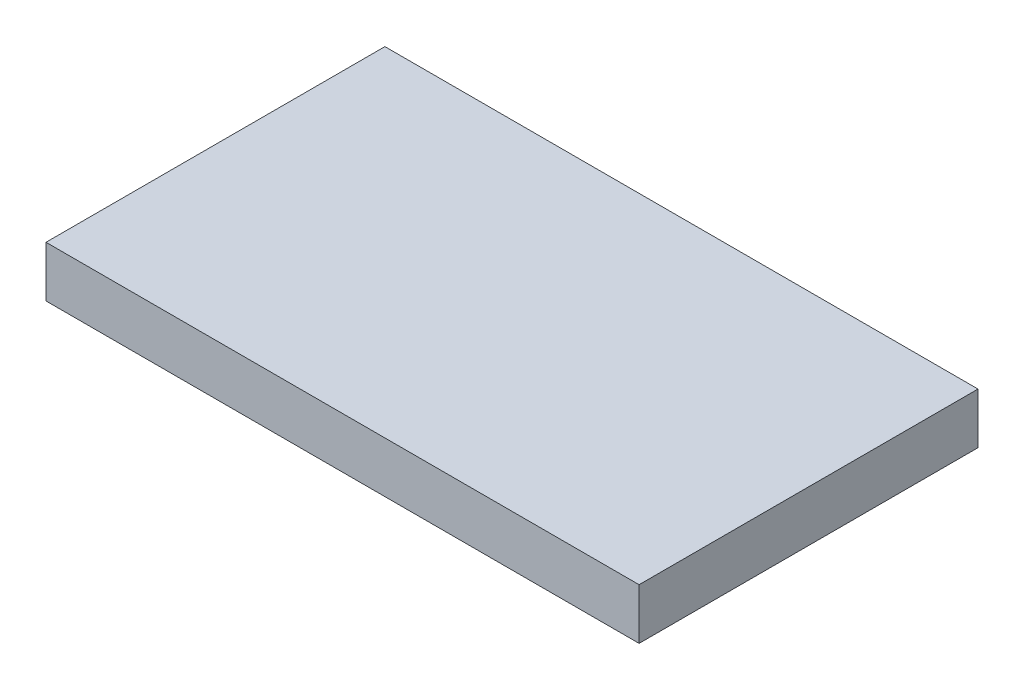
ISO-10303-21;
HEADER;
FILE_DESCRIPTION(('STEP AP214'),'2;1');
FILE_NAME('part.step','',(''),(''),'','','');
FILE_SCHEMA(('AUTOMOTIVE_DESIGN { 1 0 10303 214 1 1 1 1 }'));
ENDSEC;
DATA;
#1=APPLICATION_CONTEXT('core data for automotive mechanical design processes');
#2=APPLICATION_PROTOCOL_DEFINITION('international standard','automotive_design',2000,#1);
#3=PRODUCT_CONTEXT('',#1,'mechanical');
#4=PRODUCT('Part','Part','',(#3));
#5=PRODUCT_RELATED_PRODUCT_CATEGORY('part','',(#4));
#6=PRODUCT_DEFINITION_FORMATION('','',#4);
#7=PRODUCT_DEFINITION_CONTEXT('part definition',#1,'design');
#8=PRODUCT_DEFINITION('design','',#6,#7);
#9=PRODUCT_DEFINITION_SHAPE('','',#8);
#10=(LENGTH_UNIT() NAMED_UNIT(*) SI_UNIT(.MILLI.,.METRE.));
#11=(NAMED_UNIT(*) PLANE_ANGLE_UNIT() SI_UNIT($,.RADIAN.));
#12=(NAMED_UNIT(*) SI_UNIT($,.STERADIAN.) SOLID_ANGLE_UNIT());
#13=UNCERTAINTY_MEASURE_WITH_UNIT(LENGTH_MEASURE(1.E-05),#10,'distance_accuracy_value','');
#14=(GEOMETRIC_REPRESENTATION_CONTEXT(3) GLOBAL_UNCERTAINTY_ASSIGNED_CONTEXT((#13)) GLOBAL_UNIT_ASSIGNED_CONTEXT((#10,
#11,#12)) REPRESENTATION_CONTEXT('',''));
#15=CARTESIAN_POINT('',(0.,0.,0.));
#16=DIRECTION('',(0.,0.,1.));
#17=DIRECTION('',(1.,0.,0.));
#18=AXIS2_PLACEMENT_3D('',#15,#16,#17);
#19=CARTESIAN_POINT('',(-8.75,1.5,-5.));
#20=DIRECTION('',(1.,0.,0.));
#21=DIRECTION('',(0.,0.,-1.));
#22=AXIS2_PLACEMENT_3D('',#19,#20,#21);
#23=PLANE('',#22);
#24=DIRECTION('',(0.,0.,1.));
#25=VECTOR('',#24,1.);
#26=CARTESIAN_POINT('',(-8.75,0.,-5.));
#27=LINE('',#26,#25);
#28=CARTESIAN_POINT('',(-8.75,0.,-5.));
#29=VERTEX_POINT('',#28);
#30=CARTESIAN_POINT('',(-8.75,0.,5.));
#31=VERTEX_POINT('',#30);
#32=EDGE_CURVE('E111',#29,#31,#27,.T.);
#33=ORIENTED_EDGE('',*,*,#32,.T.);
#34=DIRECTION('',(0.,-1.,0.));
#35=VECTOR('',#34,1.);
#36=CARTESIAN_POINT('',(-8.75,1.5,5.));
#37=LINE('',#36,#35);
#38=CARTESIAN_POINT('',(-8.75,1.5,5.));
#39=VERTEX_POINT('',#38);
#40=EDGE_CURVE('E11',#39,#31,#37,.T.);
#41=ORIENTED_EDGE('',*,*,#40,.F.);
#42=DIRECTION('',(0.,0.,1.));
#43=VECTOR('',#42,1.);
#44=CARTESIAN_POINT('',(-8.75,1.5,-5.));
#45=LINE('',#44,#43);
#46=CARTESIAN_POINT('',(-8.75,1.5,-5.));
#47=VERTEX_POINT('',#46);
#48=EDGE_CURVE('E93',#47,#39,#45,.T.);
#49=ORIENTED_EDGE('',*,*,#48,.F.);
#50=DIRECTION('',(0.,-1.,0.));
#51=VECTOR('',#50,1.);
#52=CARTESIAN_POINT('',(-8.75,1.5,-5.));
#53=LINE('',#52,#51);
#54=EDGE_CURVE('E60',#47,#29,#53,.T.);
#55=ORIENTED_EDGE('',*,*,#54,.T.);
#56=EDGE_LOOP('',(#33,#41,#49,#55));
#57=FACE_BOUND('',#56,.T.);
#58=ADVANCED_FACE('F43',(#57),#23,.F.);
#59=CARTESIAN_POINT('',(-8.75,1.5,5.));
#60=DIRECTION('',(0.,0.,-1.));
#61=DIRECTION('',(-1.,0.,0.));
#62=AXIS2_PLACEMENT_3D('',#59,#60,#61);
#63=PLANE('',#62);
#64=DIRECTION('',(1.,0.,0.));
#65=VECTOR('',#64,1.);
#66=CARTESIAN_POINT('',(-8.75,0.,5.));
#67=LINE('',#66,#65);
#68=CARTESIAN_POINT('',(8.75,0.,5.));
#69=VERTEX_POINT('',#68);
#70=EDGE_CURVE('E99',#31,#69,#67,.T.);
#71=ORIENTED_EDGE('',*,*,#70,.T.);
#72=DIRECTION('',(0.,-1.,0.));
#73=VECTOR('',#72,1.);
#74=CARTESIAN_POINT('',(8.75,1.5,5.));
#75=LINE('',#74,#73);
#76=CARTESIAN_POINT('',(8.75,1.5,5.));
#77=VERTEX_POINT('',#76);
#78=EDGE_CURVE('E52',#77,#69,#75,.T.);
#79=ORIENTED_EDGE('',*,*,#78,.F.);
#80=DIRECTION('',(1.,0.,0.));
#81=VECTOR('',#80,1.);
#82=CARTESIAN_POINT('',(-8.75,1.5,5.));
#83=LINE('',#82,#81);
#84=EDGE_CURVE('E85',#39,#77,#83,.T.);
#85=ORIENTED_EDGE('',*,*,#84,.F.);
#86=ORIENTED_EDGE('',*,*,#40,.T.);
#87=EDGE_LOOP('',(#71,#79,#85,#86));
#88=FACE_BOUND('',#87,.T.);
#89=ADVANCED_FACE('F98',(#88),#63,.F.);
#90=CARTESIAN_POINT('',(8.75,1.5,-5.));
#91=DIRECTION('',(1.,0.,0.));
#92=DIRECTION('',(0.,0.,-1.));
#93=AXIS2_PLACEMENT_3D('',#90,#91,#92);
#94=PLANE('',#93);
#95=DIRECTION('',(0.,0.,1.));
#96=VECTOR('',#95,1.);
#97=CARTESIAN_POINT('',(8.75,0.,-5.));
#98=LINE('',#97,#96);
#99=CARTESIAN_POINT('',(8.75,0.,-5.));
#100=VERTEX_POINT('',#99);
#101=EDGE_CURVE('E116',#100,#69,#98,.T.);
#102=ORIENTED_EDGE('',*,*,#101,.F.);
#103=DIRECTION('',(0.,-1.,0.));
#104=VECTOR('',#103,1.);
#105=CARTESIAN_POINT('',(8.75,1.5,-5.));
#106=LINE('',#105,#104);
#107=CARTESIAN_POINT('',(8.75,1.5,-5.));
#108=VERTEX_POINT('',#107);
#109=EDGE_CURVE('E74',#108,#100,#106,.T.);
#110=ORIENTED_EDGE('',*,*,#109,.F.);
#111=DIRECTION('',(0.,0.,1.));
#112=VECTOR('',#111,1.);
#113=CARTESIAN_POINT('',(8.75,1.5,-5.));
#114=LINE('',#113,#112);
#115=EDGE_CURVE('E92',#108,#77,#114,.T.);
#116=ORIENTED_EDGE('',*,*,#115,.T.);
#117=ORIENTED_EDGE('',*,*,#78,.T.);
#118=EDGE_LOOP('',(#102,#110,#116,#117));
#119=FACE_BOUND('',#118,.T.);
#120=ADVANCED_FACE('F103',(#119),#94,.T.);
#121=CARTESIAN_POINT('',(-8.75,1.5,-5.));
#122=DIRECTION('',(0.,0.,-1.));
#123=DIRECTION('',(-1.,0.,0.));
#124=AXIS2_PLACEMENT_3D('',#121,#122,#123);
#125=PLANE('',#124);
#126=DIRECTION('',(1.,0.,0.));
#127=VECTOR('',#126,1.);
#128=CARTESIAN_POINT('',(-8.75,0.,-5.));
#129=LINE('',#128,#127);
#130=EDGE_CURVE('E119',#29,#100,#129,.T.);
#131=ORIENTED_EDGE('',*,*,#130,.F.);
#132=ORIENTED_EDGE('',*,*,#54,.F.);
#133=DIRECTION('',(1.,0.,0.));
#134=VECTOR('',#133,1.);
#135=CARTESIAN_POINT('',(-8.75,1.5,-5.));
#136=LINE('',#135,#134);
#137=EDGE_CURVE('E105',#47,#108,#136,.T.);
#138=ORIENTED_EDGE('',*,*,#137,.T.);
#139=ORIENTED_EDGE('',*,*,#109,.T.);
#140=EDGE_LOOP('',(#131,#132,#138,#139));
#141=FACE_BOUND('',#140,.T.);
#142=ADVANCED_FACE('F129',(#141),#125,.T.);
#143=CARTESIAN_POINT('',(0.,1.5,0.));
#144=DIRECTION('',(0.,1.,0.));
#145=DIRECTION('',(0.,0.,1.));
#146=AXIS2_PLACEMENT_3D('',#143,#144,#145);
#147=PLANE('',#146);
#148=ORIENTED_EDGE('',*,*,#48,.T.);
#149=ORIENTED_EDGE('',*,*,#84,.T.);
#150=ORIENTED_EDGE('',*,*,#115,.F.);
#151=ORIENTED_EDGE('',*,*,#137,.F.);
#152=EDGE_LOOP('',(#148,#149,#150,#151));
#153=FACE_BOUND('',#152,.T.);
#154=ADVANCED_FACE('F89',(#153),#147,.T.);
#155=CARTESIAN_POINT('',(0.,0.,0.));
#156=DIRECTION('',(0.,1.,0.));
#157=DIRECTION('',(0.,0.,1.));
#158=AXIS2_PLACEMENT_3D('',#155,#156,#157);
#159=PLANE('',#158);
#160=ORIENTED_EDGE('',*,*,#32,.F.);
#161=ORIENTED_EDGE('',*,*,#130,.T.);
#162=ORIENTED_EDGE('',*,*,#101,.T.);
#163=ORIENTED_EDGE('',*,*,#70,.F.);
#164=EDGE_LOOP('',(#160,#161,#162,#163));
#165=FACE_BOUND('',#164,.T.);
#166=ADVANCED_FACE('F128',(#165),#159,.F.);
#167=CLOSED_SHELL('',(#58,#89,#120,#142,#154,#166));
#168=MANIFOLD_SOLID_BREP('B2',#167);
#169=ADVANCED_BREP_SHAPE_REPRESENTATION('',(#18,#168),#14);
#170=SHAPE_DEFINITION_REPRESENTATION(#9,#169);
ENDSEC;
END-ISO-10303-21;
